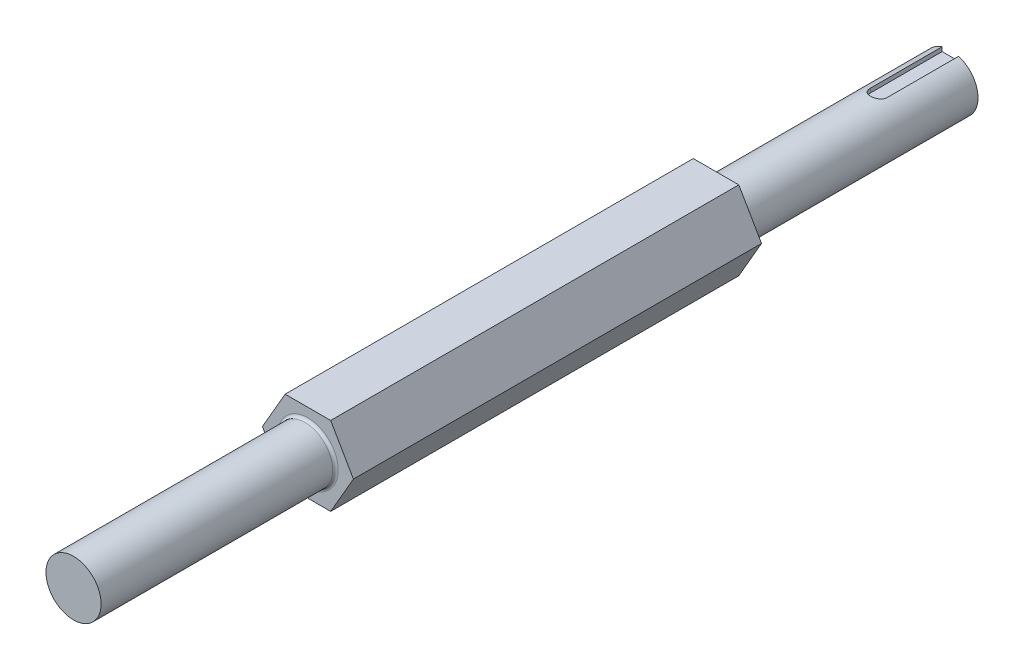
ISO-10303-21;
HEADER;
FILE_DESCRIPTION(('STEP AP214'),'2;1');
FILE_NAME('part.step','',(''),(''),'','','');
FILE_SCHEMA(('AUTOMOTIVE_DESIGN { 1 0 10303 214 1 1 1 1 }'));
ENDSEC;
DATA;
#1=APPLICATION_CONTEXT('core data for automotive mechanical design processes');
#2=APPLICATION_PROTOCOL_DEFINITION('international standard','automotive_design',2000,#1);
#3=PRODUCT_CONTEXT('',#1,'mechanical');
#4=PRODUCT('Part','Part','',(#3));
#5=PRODUCT_RELATED_PRODUCT_CATEGORY('part','',(#4));
#6=PRODUCT_DEFINITION_FORMATION('','',#4);
#7=PRODUCT_DEFINITION_CONTEXT('part definition',#1,'design');
#8=PRODUCT_DEFINITION('design','',#6,#7);
#9=PRODUCT_DEFINITION_SHAPE('','',#8);
#10=(LENGTH_UNIT() NAMED_UNIT(*) SI_UNIT(.MILLI.,.METRE.));
#11=(NAMED_UNIT(*) PLANE_ANGLE_UNIT() SI_UNIT($,.RADIAN.));
#12=(NAMED_UNIT(*) SI_UNIT($,.STERADIAN.) SOLID_ANGLE_UNIT());
#13=UNCERTAINTY_MEASURE_WITH_UNIT(LENGTH_MEASURE(1.E-05),#10,'distance_accuracy_value','');
#14=(GEOMETRIC_REPRESENTATION_CONTEXT(3) GLOBAL_UNCERTAINTY_ASSIGNED_CONTEXT((#13)) GLOBAL_UNIT_ASSIGNED_CONTEXT((#10,
#11,#12)) REPRESENTATION_CONTEXT('',''));
#15=CARTESIAN_POINT('',(0.,0.,0.));
#16=DIRECTION('',(0.,0.,1.));
#17=DIRECTION('',(1.,0.,0.));
#18=AXIS2_PLACEMENT_3D('',#15,#16,#17);
#19=CARTESIAN_POINT('',(0.,0.,-159.));
#20=DIRECTION('',(0.,0.,1.));
#21=DIRECTION('',(1.,0.,0.));
#22=AXIS2_PLACEMENT_3D('',#19,#20,#21);
#23=CYLINDRICAL_SURFACE('',#22,10.);
#24=DIRECTION('',(0.,0.,1.));
#25=VECTOR('',#24,1.);
#26=CARTESIAN_POINT('',(-3.,9.53939201416946,-159.));
#27=LINE('',#26,#25);
#28=CARTESIAN_POINT('',(-3.,9.53939201416946,-159.));
#29=VERTEX_POINT('',#28);
#30=CARTESIAN_POINT('',(-3.,9.53939201416946,-133.));
#31=VERTEX_POINT('',#30);
#32=EDGE_CURVE('E202',#29,#31,#27,.T.);
#33=ORIENTED_EDGE('',*,*,#32,.F.);
#34=CARTESIAN_POINT('',(0.,0.,-159.));
#35=DIRECTION('',(0.,0.,1.));
#36=DIRECTION('',(1.,0.,0.));
#37=AXIS2_PLACEMENT_3D('',#34,#35,#36);
#38=CIRCLE('',#37,10.);
#39=CARTESIAN_POINT('',(3.,9.53939201416946,-159.));
#40=VERTEX_POINT('',#39);
#41=EDGE_CURVE('E199',#29,#40,#38,.T.);
#42=ORIENTED_EDGE('',*,*,#41,.T.);
#43=DIRECTION('',(0.,0.,1.));
#44=VECTOR('',#43,1.);
#45=CARTESIAN_POINT('',(3.,9.53939201416946,-159.));
#46=LINE('',#45,#44);
#47=CARTESIAN_POINT('',(3.,9.53939201416946,-133.));
#48=VERTEX_POINT('',#47);
#49=EDGE_CURVE('E378',#40,#48,#46,.T.);
#50=ORIENTED_EDGE('',*,*,#49,.T.);
#51=CARTESIAN_POINT('',(-3.,9.53939201416946,-133.));
#52=CARTESIAN_POINT('',(-3.00001027845727,9.53938054248207,-132.917664479177));
#53=CARTESIAN_POINT('',(-2.99661062684472,9.54045772064378,-132.835335544937));
#54=CARTESIAN_POINT('',(-2.98307142899347,9.54470412105986,-132.671306047235));
#55=CARTESIAN_POINT('',(-2.97293339805418,9.54787287296849,-132.589605346676));
#56=CARTESIAN_POINT('',(-2.94603140625045,9.55620668351003,-132.427615084327));
#57=CARTESIAN_POINT('',(-2.92928426957738,9.56136667250114,-132.347322475957));
#58=CARTESIAN_POINT('',(-2.88932853030395,9.57351626651178,-132.188524155866));
#59=CARTESIAN_POINT('',(-2.86611975872641,9.58050591937828,-132.110018490933));
#60=CARTESIAN_POINT('',(-2.78708584446024,9.60391637654137,-131.87805061201));
#61=CARTESIAN_POINT('',(-2.72181852542972,9.62279007830391,-131.727931561167));
#62=CARTESIAN_POINT('',(-2.56815043531275,9.66493213967819,-131.440773956021));
#63=CARTESIAN_POINT('',(-2.4797388992416,9.68820254290641,-131.303741529238));
#64=CARTESIAN_POINT('',(-2.27929879634443,9.73733650515374,-131.042277012052));
#65=CARTESIAN_POINT('',(-2.16666914746584,9.76325505469874,-130.918315125939));
#66=CARTESIAN_POINT('',(-1.92227736150433,9.81429628475077,-130.690726385161));
#67=CARTESIAN_POINT('',(-1.79051199848164,9.8394188301941,-130.587102966139));
#68=CARTESIAN_POINT('',(-1.50821997465697,9.88666477976534,-130.401073134905));
#69=CARTESIAN_POINT('',(-1.35736167401015,9.90871541546878,-130.319149820217));
#70=CARTESIAN_POINT('',(-1.04324233568302,9.94668940088144,-130.182022995997));
#71=CARTESIAN_POINT('',(-0.879984508687983,9.96261433032403,-130.126812596632));
#72=CARTESIAN_POINT('',(-0.550649404820606,9.98615279768398,-130.046240448209));
#73=CARTESIAN_POINT('',(-0.384786253016207,9.99399098526792,-130.020070296482));
#74=CARTESIAN_POINT('',(-0.0508471415689336,10.0012640407204,-129.995765304854));
#75=CARTESIAN_POINT('',(0.117228393125331,10.0007004995012,-129.997625157322));
#76=CARTESIAN_POINT('',(0.445143199271816,9.99139205125586,-130.028785820691));
#77=CARTESIAN_POINT('',(0.605074290763022,9.98290831016512,-130.057210690808));
#78=CARTESIAN_POINT('',(0.917780104370308,9.95903027401823,-130.139263269625));
#79=CARTESIAN_POINT('',(1.07055445110878,9.94363561692558,-130.192892298683));
#80=CARTESIAN_POINT('',(1.3666956317391,9.90730429851782,-130.324424443525));
#81=CARTESIAN_POINT('',(1.50993201207611,9.88630511384915,-130.402603288776));
#82=CARTESIAN_POINT('',(1.78153105916098,9.84099249303647,-130.580797180034));
#83=CARTESIAN_POINT('',(1.90989038323249,9.81667831471806,-130.680817118941));
#84=CARTESIAN_POINT('',(2.15330901082205,9.7662334714278,-130.904383976185));
#85=CARTESIAN_POINT('',(2.26766702955975,9.74006890899097,-131.028687727526));
#86=CARTESIAN_POINT('',(2.47413538985067,9.68968430229327,-131.294994846851));
#87=CARTESIAN_POINT('',(2.5662392402618,9.66546482675133,-131.43700336073));
#88=CARTESIAN_POINT('',(2.72632814481702,9.62154457591303,-131.7365618569));
#89=CARTESIAN_POINT('',(2.79406012682263,9.60189192491895,-131.894254359187));
#90=CARTESIAN_POINT('',(2.90171772009405,9.56991327306402,-132.219449007963));
#91=CARTESIAN_POINT('',(2.94168586436072,9.55757606951749,-132.386935721429));
#92=CARTESIAN_POINT('',(2.97802407180159,9.54628064650012,-132.62998977814));
#93=CARTESIAN_POINT('',(2.98626405978017,9.54370312550533,-132.703781468359));
#94=CARTESIAN_POINT('',(2.99724711229709,9.54025857223564,-132.851702958199));
#95=CARTESIAN_POINT('',(2.99999825936538,9.53938902493288,-132.925832099328));
#96=CARTESIAN_POINT('',(3.,9.53939201416945,-133.));
#97=B_SPLINE_CURVE_WITH_KNOTS('',3,(#51,#52,#53,#54,#55,#56,#57,#58,#59,#60,#61,#62,#63,#64,#65,
#66,#67,#68,#69,#70,#71,#72,#73,#74,#75,#76,#77,#78,#79,#80,#81,#82,#83,#84,#85,#86,#87,#88,#89,
#90,#91,#92,#93,#94,#95,#96),.UNSPECIFIED.,.F.,.F.,(4,2,2,2,2,2,2,2,2,2,2,2,2,2,2,2,2,2,2,2,2,2,
4),(0.,0.246918142439474,0.493780777706052,0.740019009622984,0.986263681482012,1.47813347402026,
1.97023245590778,2.47635119822767,2.98255536239032,3.49922810620071,4.01576751791672,
4.51753600864763,5.019209488041,5.50490358251092,5.9906231236083,6.48200583350618,
6.97349873739168,7.48389234847122,7.99443465298715,8.51013494368215,9.02504345105572,
9.24774267716777,9.47011372732391),.UNSPECIFIED.);
#98=EDGE_CURVE('E13',#31,#48,#97,.T.);
#99=ORIENTED_EDGE('',*,*,#98,.F.);
#100=EDGE_LOOP('',(#33,#42,#50,#99));
#101=FACE_BOUND('',#100,.T.);
#102=CARTESIAN_POINT('',(0.,0.,-75.));
#103=DIRECTION('',(0.,0.,1.));
#104=DIRECTION('',(1.,0.,0.));
#105=AXIS2_PLACEMENT_3D('',#102,#103,#104);
#106=CIRCLE('',#105,10.);
#107=CARTESIAN_POINT('',(10.,0.,-75.));
#108=VERTEX_POINT('',#107);
#109=EDGE_CURVE('E175',#108,#108,#106,.F.);
#110=ORIENTED_EDGE('',*,*,#109,.T.);
#111=EDGE_LOOP('',(#110));
#112=FACE_BOUND('',#111,.T.);
#113=ADVANCED_FACE('F49',(#101,#112),#23,.T.);
#114=CARTESIAN_POINT('',(8.25033534671975,-14.29,74.));
#115=DIRECTION('',(-0.866025403784439,0.499999999999999,0.));
#116=DIRECTION('',(-0.499999999999999,-0.866025403784439,0.));
#117=AXIS2_PLACEMENT_3D('',#114,#115,#116);
#118=PLANE('',#117);
#119=DIRECTION('',(0.499999999999999,0.866025403784439,0.));
#120=VECTOR('',#119,1.);
#121=CARTESIAN_POINT('',(8.25033534671975,-14.29,-74.));
#122=LINE('',#121,#120);
#123=CARTESIAN_POINT('',(8.25033534671975,-14.29,-74.));
#124=VERTEX_POINT('',#123);
#125=CARTESIAN_POINT('',(16.5006706934395,0.,-74.));
#126=VERTEX_POINT('',#125);
#127=EDGE_CURVE('E151',#124,#126,#122,.T.);
#128=ORIENTED_EDGE('',*,*,#127,.T.);
#129=DIRECTION('',(0.,0.,-1.));
#130=VECTOR('',#129,1.);
#131=CARTESIAN_POINT('',(16.5006706934395,0.,74.));
#132=LINE('',#131,#130);
#133=CARTESIAN_POINT('',(16.5006706934395,0.,74.));
#134=VERTEX_POINT('',#133);
#135=EDGE_CURVE('E170',#134,#126,#132,.T.);
#136=ORIENTED_EDGE('',*,*,#135,.F.);
#137=DIRECTION('',(0.499999999999999,0.866025403784439,0.));
#138=VECTOR('',#137,1.);
#139=CARTESIAN_POINT('',(8.25033534671975,-14.29,74.));
#140=LINE('',#139,#138);
#141=CARTESIAN_POINT('',(8.25033534671975,-14.29,74.));
#142=VERTEX_POINT('',#141);
#143=EDGE_CURVE('E163',#142,#134,#140,.T.);
#144=ORIENTED_EDGE('',*,*,#143,.F.);
#145=DIRECTION('',(0.,0.,-1.));
#146=VECTOR('',#145,1.);
#147=CARTESIAN_POINT('',(8.25033534671975,-14.29,74.));
#148=LINE('',#147,#146);
#149=EDGE_CURVE('E147',#142,#124,#148,.T.);
#150=ORIENTED_EDGE('',*,*,#149,.T.);
#151=EDGE_LOOP('',(#128,#136,#144,#150));
#152=FACE_BOUND('',#151,.T.);
#153=ADVANCED_FACE('F217',(#152),#118,.F.);
#154=CARTESIAN_POINT('',(16.5006706934395,0.,74.));
#155=DIRECTION('',(-0.866025403784438,-0.5,0.));
#156=DIRECTION('',(0.5,-0.866025403784439,0.));
#157=AXIS2_PLACEMENT_3D('',#154,#155,#156);
#158=PLANE('',#157);
#159=DIRECTION('',(-0.5,0.866025403784439,0.));
#160=VECTOR('',#159,1.);
#161=CARTESIAN_POINT('',(16.5006706934395,0.,-74.));
#162=LINE('',#161,#160);
#163=CARTESIAN_POINT('',(8.25033534671975,14.29,-74.));
#164=VERTEX_POINT('',#163);
#165=EDGE_CURVE('E154',#126,#164,#162,.T.);
#166=ORIENTED_EDGE('',*,*,#165,.T.);
#167=DIRECTION('',(0.,0.,-1.));
#168=VECTOR('',#167,1.);
#169=CARTESIAN_POINT('',(8.25033534671975,14.29,74.));
#170=LINE('',#169,#168);
#171=CARTESIAN_POINT('',(8.25033534671975,14.29,74.));
#172=VERTEX_POINT('',#171);
#173=EDGE_CURVE('E167',#172,#164,#170,.T.);
#174=ORIENTED_EDGE('',*,*,#173,.F.);
#175=DIRECTION('',(-0.5,0.866025403784439,0.));
#176=VECTOR('',#175,1.);
#177=CARTESIAN_POINT('',(16.5006706934395,0.,74.));
#178=LINE('',#177,#176);
#179=EDGE_CURVE('E114',#134,#172,#178,.T.);
#180=ORIENTED_EDGE('',*,*,#179,.F.);
#181=ORIENTED_EDGE('',*,*,#135,.T.);
#182=EDGE_LOOP('',(#166,#174,#180,#181));
#183=FACE_BOUND('',#182,.T.);
#184=ADVANCED_FACE('F209',(#183),#158,.F.);
#185=CARTESIAN_POINT('',(8.25033534671975,14.29,74.));
#186=DIRECTION('',(0.,-1.,0.));
#187=DIRECTION('',(1.,0.,0.));
#188=AXIS2_PLACEMENT_3D('',#185,#186,#187);
#189=PLANE('',#188);
#190=DIRECTION('',(-1.,0.,0.));
#191=VECTOR('',#190,1.);
#192=CARTESIAN_POINT('',(8.25033534671975,14.29,-74.));
#193=LINE('',#192,#191);
#194=CARTESIAN_POINT('',(-8.25033534671975,14.29,-74.));
#195=VERTEX_POINT('',#194);
#196=EDGE_CURVE('E157',#164,#195,#193,.T.);
#197=ORIENTED_EDGE('',*,*,#196,.T.);
#198=DIRECTION('',(0.,0.,-1.));
#199=VECTOR('',#198,1.);
#200=CARTESIAN_POINT('',(-8.25033534671975,14.29,74.));
#201=LINE('',#200,#199);
#202=CARTESIAN_POINT('',(-8.25033534671975,14.29,74.));
#203=VERTEX_POINT('',#202);
#204=EDGE_CURVE('E142',#203,#195,#201,.T.);
#205=ORIENTED_EDGE('',*,*,#204,.F.);
#206=DIRECTION('',(-1.,0.,0.));
#207=VECTOR('',#206,1.);
#208=CARTESIAN_POINT('',(8.25033534671975,14.29,74.));
#209=LINE('',#208,#207);
#210=EDGE_CURVE('E130',#172,#203,#209,.T.);
#211=ORIENTED_EDGE('',*,*,#210,.F.);
#212=ORIENTED_EDGE('',*,*,#173,.T.);
#213=EDGE_LOOP('',(#197,#205,#211,#212));
#214=FACE_BOUND('',#213,.T.);
#215=ADVANCED_FACE('F212',(#214),#189,.F.);
#216=CARTESIAN_POINT('',(-8.25033534671975,14.29,74.));
#217=DIRECTION('',(0.866025403784439,-0.499999999999999,0.));
#218=DIRECTION('',(0.499999999999999,0.866025403784439,0.));
#219=AXIS2_PLACEMENT_3D('',#216,#217,#218);
#220=PLANE('',#219);
#221=DIRECTION('',(-0.499999999999999,-0.866025403784439,0.));
#222=VECTOR('',#221,1.);
#223=CARTESIAN_POINT('',(-8.25033534671975,14.29,-74.));
#224=LINE('',#223,#222);
#225=CARTESIAN_POINT('',(-16.5006706934395,0.,-74.));
#226=VERTEX_POINT('',#225);
#227=EDGE_CURVE('E139',#195,#226,#224,.T.);
#228=ORIENTED_EDGE('',*,*,#227,.T.);
#229=DIRECTION('',(0.,0.,-1.));
#230=VECTOR('',#229,1.);
#231=CARTESIAN_POINT('',(-16.5006706934395,0.,74.));
#232=LINE('',#231,#230);
#233=CARTESIAN_POINT('',(-16.5006706934395,0.,74.));
#234=VERTEX_POINT('',#233);
#235=EDGE_CURVE('E136',#234,#226,#232,.T.);
#236=ORIENTED_EDGE('',*,*,#235,.F.);
#237=DIRECTION('',(-0.499999999999999,-0.866025403784439,0.));
#238=VECTOR('',#237,1.);
#239=CARTESIAN_POINT('',(-8.25033534671975,14.29,74.));
#240=LINE('',#239,#238);
#241=EDGE_CURVE('E123',#203,#234,#240,.T.);
#242=ORIENTED_EDGE('',*,*,#241,.F.);
#243=ORIENTED_EDGE('',*,*,#204,.T.);
#244=EDGE_LOOP('',(#228,#236,#242,#243));
#245=FACE_BOUND('',#244,.T.);
#246=ADVANCED_FACE('F137',(#245),#220,.F.);
#247=CARTESIAN_POINT('',(-16.5006706934395,0.,74.));
#248=DIRECTION('',(0.866025403784438,0.5,0.));
#249=DIRECTION('',(-0.5,0.866025403784439,0.));
#250=AXIS2_PLACEMENT_3D('',#247,#248,#249);
#251=PLANE('',#250);
#252=DIRECTION('',(0.5,-0.866025403784439,0.));
#253=VECTOR('',#252,1.);
#254=CARTESIAN_POINT('',(-16.5006706934395,0.,-74.));
#255=LINE('',#254,#253);
#256=CARTESIAN_POINT('',(-8.25033534671974,-14.29,-74.));
#257=VERTEX_POINT('',#256);
#258=EDGE_CURVE('E160',#226,#257,#255,.T.);
#259=ORIENTED_EDGE('',*,*,#258,.T.);
#260=DIRECTION('',(0.,0.,-1.));
#261=VECTOR('',#260,1.);
#262=CARTESIAN_POINT('',(-8.25033534671974,-14.29,74.));
#263=LINE('',#262,#261);
#264=CARTESIAN_POINT('',(-8.25033534671974,-14.29,74.));
#265=VERTEX_POINT('',#264);
#266=EDGE_CURVE('E143',#265,#257,#263,.T.);
#267=ORIENTED_EDGE('',*,*,#266,.F.);
#268=DIRECTION('',(0.5,-0.866025403784439,0.));
#269=VECTOR('',#268,1.);
#270=CARTESIAN_POINT('',(-16.5006706934395,0.,74.));
#271=LINE('',#270,#269);
#272=EDGE_CURVE('E127',#234,#265,#271,.T.);
#273=ORIENTED_EDGE('',*,*,#272,.F.);
#274=ORIENTED_EDGE('',*,*,#235,.T.);
#275=EDGE_LOOP('',(#259,#267,#273,#274));
#276=FACE_BOUND('',#275,.T.);
#277=ADVANCED_FACE('F145',(#276),#251,.F.);
#278=CARTESIAN_POINT('',(-8.25033534671974,-14.29,74.));
#279=DIRECTION('',(0.,1.,0.));
#280=DIRECTION('',(-1.,0.,0.));
#281=AXIS2_PLACEMENT_3D('',#278,#279,#280);
#282=PLANE('',#281);
#283=DIRECTION('',(1.,0.,0.));
#284=VECTOR('',#283,1.);
#285=CARTESIAN_POINT('',(-8.25033534671974,-14.29,-74.));
#286=LINE('',#285,#284);
#287=EDGE_CURVE('E105',#257,#124,#286,.T.);
#288=ORIENTED_EDGE('',*,*,#287,.T.);
#289=ORIENTED_EDGE('',*,*,#149,.F.);
#290=DIRECTION('',(1.,0.,0.));
#291=VECTOR('',#290,1.);
#292=CARTESIAN_POINT('',(-8.25033534671974,-14.29,74.));
#293=LINE('',#292,#291);
#294=EDGE_CURVE('E78',#265,#142,#293,.T.);
#295=ORIENTED_EDGE('',*,*,#294,.F.);
#296=ORIENTED_EDGE('',*,*,#266,.T.);
#297=EDGE_LOOP('',(#288,#289,#295,#296));
#298=FACE_BOUND('',#297,.T.);
#299=ADVANCED_FACE('F215',(#298),#282,.F.);
#300=CARTESIAN_POINT('',(0.,0.,74.));
#301=DIRECTION('',(0.,0.,1.));
#302=DIRECTION('',(1.,0.,0.));
#303=AXIS2_PLACEMENT_3D('',#300,#301,#302);
#304=PLANE('',#303);
#305=CARTESIAN_POINT('',(0.,0.,74.));
#306=DIRECTION('',(0.,0.,1.));
#307=DIRECTION('',(1.,0.,0.));
#308=AXIS2_PLACEMENT_3D('',#305,#306,#307);
#309=CIRCLE('',#308,11.);
#310=CARTESIAN_POINT('',(11.,0.,74.));
#311=VERTEX_POINT('',#310);
#312=EDGE_CURVE('E62',#311,#311,#309,.F.);
#313=ORIENTED_EDGE('',*,*,#312,.T.);
#314=EDGE_LOOP('',(#313));
#315=FACE_BOUND('',#314,.T.);
#316=ORIENTED_EDGE('',*,*,#143,.T.);
#317=ORIENTED_EDGE('',*,*,#179,.T.);
#318=ORIENTED_EDGE('',*,*,#210,.T.);
#319=ORIENTED_EDGE('',*,*,#241,.T.);
#320=ORIENTED_EDGE('',*,*,#272,.T.);
#321=ORIENTED_EDGE('',*,*,#294,.T.);
#322=EDGE_LOOP('',(#316,#317,#318,#319,#320,#321));
#323=FACE_BOUND('',#322,.T.);
#324=ADVANCED_FACE('F125',(#315,#323),#304,.T.);
#325=CARTESIAN_POINT('',(0.,0.,-74.));
#326=DIRECTION('',(0.,0.,1.));
#327=DIRECTION('',(1.,0.,0.));
#328=AXIS2_PLACEMENT_3D('',#325,#326,#327);
#329=PLANE('',#328);
#330=CARTESIAN_POINT('',(0.,0.,-74.));
#331=DIRECTION('',(0.,0.,1.));
#332=DIRECTION('',(1.,0.,0.));
#333=AXIS2_PLACEMENT_3D('',#330,#331,#332);
#334=CIRCLE('',#333,11.);
#335=CARTESIAN_POINT('',(11.,0.,-74.));
#336=VERTEX_POINT('',#335);
#337=EDGE_CURVE('E172',#336,#336,#334,.T.);
#338=ORIENTED_EDGE('',*,*,#337,.T.);
#339=EDGE_LOOP('',(#338));
#340=FACE_BOUND('',#339,.T.);
#341=ORIENTED_EDGE('',*,*,#127,.F.);
#342=ORIENTED_EDGE('',*,*,#287,.F.);
#343=ORIENTED_EDGE('',*,*,#258,.F.);
#344=ORIENTED_EDGE('',*,*,#227,.F.);
#345=ORIENTED_EDGE('',*,*,#196,.F.);
#346=ORIENTED_EDGE('',*,*,#165,.F.);
#347=EDGE_LOOP('',(#341,#342,#343,#344,#345,#346));
#348=FACE_BOUND('',#347,.T.);
#349=ADVANCED_FACE('F194',(#340,#348),#329,.F.);
#350=CARTESIAN_POINT('',(0.,0.,159.));
#351=DIRECTION('',(0.,0.,-1.));
#352=DIRECTION('',(-1.,0.,0.));
#353=AXIS2_PLACEMENT_3D('',#350,#351,#352);
#354=CYLINDRICAL_SURFACE('',#353,10.);
#355=CARTESIAN_POINT('',(0.,0.,75.));
#356=DIRECTION('',(0.,0.,1.));
#357=DIRECTION('',(1.,0.,0.));
#358=AXIS2_PLACEMENT_3D('',#355,#356,#357);
#359=CIRCLE('',#358,10.);
#360=CARTESIAN_POINT('',(10.,0.,75.));
#361=VERTEX_POINT('',#360);
#362=EDGE_CURVE('E178',#361,#361,#359,.T.);
#363=ORIENTED_EDGE('',*,*,#362,.T.);
#364=EDGE_LOOP('',(#363));
#365=FACE_BOUND('',#364,.T.);
#366=CARTESIAN_POINT('',(0.,0.,159.));
#367=DIRECTION('',(0.,0.,1.));
#368=DIRECTION('',(1.,0.,0.));
#369=AXIS2_PLACEMENT_3D('',#366,#367,#368);
#370=CIRCLE('',#369,10.);
#371=CARTESIAN_POINT('',(10.,0.,159.));
#372=VERTEX_POINT('',#371);
#373=EDGE_CURVE('E155',#372,#372,#370,.T.);
#374=ORIENTED_EDGE('',*,*,#373,.F.);
#375=EDGE_LOOP('',(#374));
#376=FACE_BOUND('',#375,.T.);
#377=ADVANCED_FACE('F190',(#365,#376),#354,.T.);
#378=CARTESIAN_POINT('',(0.,0.,159.));
#379=DIRECTION('',(0.,0.,1.));
#380=DIRECTION('',(1.,0.,0.));
#381=AXIS2_PLACEMENT_3D('',#378,#379,#380);
#382=PLANE('',#381);
#383=ORIENTED_EDGE('',*,*,#373,.T.);
#384=EDGE_LOOP('',(#383));
#385=FACE_BOUND('',#384,.T.);
#386=ADVANCED_FACE('F193',(#385),#382,.T.);
#387=CARTESIAN_POINT('',(0.,0.,-159.));
#388=DIRECTION('',(0.,0.,-1.));
#389=DIRECTION('',(1.,0.,0.));
#390=AXIS2_PLACEMENT_3D('',#387,#388,#389);
#391=PLANE('',#390);
#392=DIRECTION('',(0.,1.,0.));
#393=VECTOR('',#392,1.);
#394=CARTESIAN_POINT('',(-3.,8.,-159.));
#395=LINE('',#394,#393);
#396=CARTESIAN_POINT('',(-3.,8.,-159.));
#397=VERTEX_POINT('',#396);
#398=EDGE_CURVE('E376',#397,#29,#395,.T.);
#399=ORIENTED_EDGE('',*,*,#398,.F.);
#400=DIRECTION('',(1.,0.,0.));
#401=VECTOR('',#400,1.);
#402=CARTESIAN_POINT('',(0.,8.,-159.));
#403=LINE('',#402,#401);
#404=CARTESIAN_POINT('',(3.,8.,-159.));
#405=VERTEX_POINT('',#404);
#406=EDGE_CURVE('E365',#397,#405,#403,.T.);
#407=ORIENTED_EDGE('',*,*,#406,.T.);
#408=DIRECTION('',(0.,1.,0.));
#409=VECTOR('',#408,1.);
#410=CARTESIAN_POINT('',(3.,8.,-159.));
#411=LINE('',#410,#409);
#412=EDGE_CURVE('E379',#405,#40,#411,.T.);
#413=ORIENTED_EDGE('',*,*,#412,.T.);
#414=ORIENTED_EDGE('',*,*,#41,.F.);
#415=EDGE_LOOP('',(#399,#407,#413,#414));
#416=FACE_BOUND('',#415,.T.);
#417=ADVANCED_FACE('F228',(#416),#391,.T.);
#418=CARTESIAN_POINT('',(0.,0.,-75.));
#419=DIRECTION('',(0.,0.,1.));
#420=DIRECTION('',(1.,0.,0.));
#421=AXIS2_PLACEMENT_3D('',#418,#419,#420);
#422=TOROIDAL_SURFACE('',#421,11.,1.);
#423=ORIENTED_EDGE('',*,*,#109,.F.);
#424=EDGE_LOOP('',(#423));
#425=FACE_BOUND('',#424,.T.);
#426=ORIENTED_EDGE('',*,*,#337,.F.);
#427=EDGE_LOOP('',(#426));
#428=FACE_BOUND('',#427,.T.);
#429=ADVANCED_FACE('F187',(#425,#428),#422,.F.);
#430=CARTESIAN_POINT('',(0.,0.,75.));
#431=DIRECTION('',(0.,0.,1.));
#432=DIRECTION('',(1.,0.,0.));
#433=AXIS2_PLACEMENT_3D('',#430,#431,#432);
#434=TOROIDAL_SURFACE('',#433,11.,1.);
#435=ORIENTED_EDGE('',*,*,#312,.F.);
#436=EDGE_LOOP('',(#435));
#437=FACE_BOUND('',#436,.T.);
#438=ORIENTED_EDGE('',*,*,#362,.F.);
#439=EDGE_LOOP('',(#438));
#440=FACE_BOUND('',#439,.T.);
#441=ADVANCED_FACE('F51',(#437,#440),#434,.F.);
#442=CARTESIAN_POINT('',(-2.99999999999998,8.,0.));
#443=DIRECTION('',(-1.,0.,0.));
#444=DIRECTION('',(0.,0.,1.));
#445=AXIS2_PLACEMENT_3D('',#442,#443,#444);
#446=PLANE('',#445);
#447=ORIENTED_EDGE('',*,*,#32,.T.);
#448=DIRECTION('',(0.,1.,0.));
#449=VECTOR('',#448,1.);
#450=CARTESIAN_POINT('',(-3.,8.,-133.));
#451=LINE('',#450,#449);
#452=CARTESIAN_POINT('',(-3.,8.,-133.));
#453=VERTEX_POINT('',#452);
#454=EDGE_CURVE('E375',#453,#31,#451,.T.);
#455=ORIENTED_EDGE('',*,*,#454,.F.);
#456=DIRECTION('',(0.,0.,1.));
#457=VECTOR('',#456,1.);
#458=CARTESIAN_POINT('',(-2.99999999999998,8.,0.));
#459=LINE('',#458,#457);
#460=EDGE_CURVE('E359',#397,#453,#459,.T.);
#461=ORIENTED_EDGE('',*,*,#460,.F.);
#462=ORIENTED_EDGE('',*,*,#398,.T.);
#463=EDGE_LOOP('',(#447,#455,#461,#462));
#464=FACE_BOUND('',#463,.T.);
#465=ADVANCED_FACE('F186',(#464),#446,.F.);
#466=CARTESIAN_POINT('',(3.00000000000002,8.,0.));
#467=DIRECTION('',(-1.,0.,0.));
#468=DIRECTION('',(0.,0.,1.));
#469=AXIS2_PLACEMENT_3D('',#466,#467,#468);
#470=PLANE('',#469);
#471=ORIENTED_EDGE('',*,*,#412,.F.);
#472=DIRECTION('',(0.,0.,1.));
#473=VECTOR('',#472,1.);
#474=CARTESIAN_POINT('',(3.00000000000002,8.,0.));
#475=LINE('',#474,#473);
#476=CARTESIAN_POINT('',(3.,8.,-133.));
#477=VERTEX_POINT('',#476);
#478=EDGE_CURVE('E69',#405,#477,#475,.T.);
#479=ORIENTED_EDGE('',*,*,#478,.T.);
#480=DIRECTION('',(0.,1.,0.));
#481=VECTOR('',#480,1.);
#482=CARTESIAN_POINT('',(3.,8.,-133.));
#483=LINE('',#482,#481);
#484=EDGE_CURVE('E382',#477,#48,#483,.T.);
#485=ORIENTED_EDGE('',*,*,#484,.T.);
#486=ORIENTED_EDGE('',*,*,#49,.F.);
#487=EDGE_LOOP('',(#471,#479,#485,#486));
#488=FACE_BOUND('',#487,.T.);
#489=ADVANCED_FACE('F317',(#488),#470,.T.);
#490=CARTESIAN_POINT('',(0.,8.,-133.));
#491=DIRECTION('',(0.,1.,0.));
#492=DIRECTION('',(-1.,0.,0.));
#493=AXIS2_PLACEMENT_3D('',#490,#491,#492);
#494=CYLINDRICAL_SURFACE('',#493,3.);
#495=ORIENTED_EDGE('',*,*,#454,.T.);
#496=ORIENTED_EDGE('',*,*,#98,.T.);
#497=ORIENTED_EDGE('',*,*,#484,.F.);
#498=CARTESIAN_POINT('',(0.,8.,-133.));
#499=DIRECTION('',(0.,1.,0.));
#500=DIRECTION('',(-1.,0.,0.));
#501=AXIS2_PLACEMENT_3D('',#498,#499,#500);
#502=CIRCLE('',#501,3.);
#503=EDGE_CURVE('E362',#453,#477,#502,.T.);
#504=ORIENTED_EDGE('',*,*,#503,.F.);
#505=EDGE_LOOP('',(#495,#496,#497,#504));
#506=FACE_BOUND('',#505,.T.);
#507=ADVANCED_FACE('F327',(#506),#494,.F.);
#508=CARTESIAN_POINT('',(0.,8.,0.));
#509=DIRECTION('',(0.,1.,0.));
#510=DIRECTION('',(-1.,0.,0.));
#511=AXIS2_PLACEMENT_3D('',#508,#509,#510);
#512=PLANE('',#511);
#513=ORIENTED_EDGE('',*,*,#460,.T.);
#514=ORIENTED_EDGE('',*,*,#503,.T.);
#515=ORIENTED_EDGE('',*,*,#478,.F.);
#516=ORIENTED_EDGE('',*,*,#406,.F.);
#517=EDGE_LOOP('',(#513,#514,#515,#516));
#518=FACE_BOUND('',#517,.T.);
#519=ADVANCED_FACE('F337',(#518),#512,.T.);
#520=CLOSED_SHELL('',(#113,#153,#184,#215,#246,#277,#299,#324,#349,#377,#386,#417,#429,#441,
#465,#489,#507,#519));
#521=MANIFOLD_SOLID_BREP('B2',#520);
#522=ADVANCED_BREP_SHAPE_REPRESENTATION('',(#18,#521),#14);
#523=SHAPE_DEFINITION_REPRESENTATION(#9,#522);
ENDSEC;
END-ISO-10303-21;
